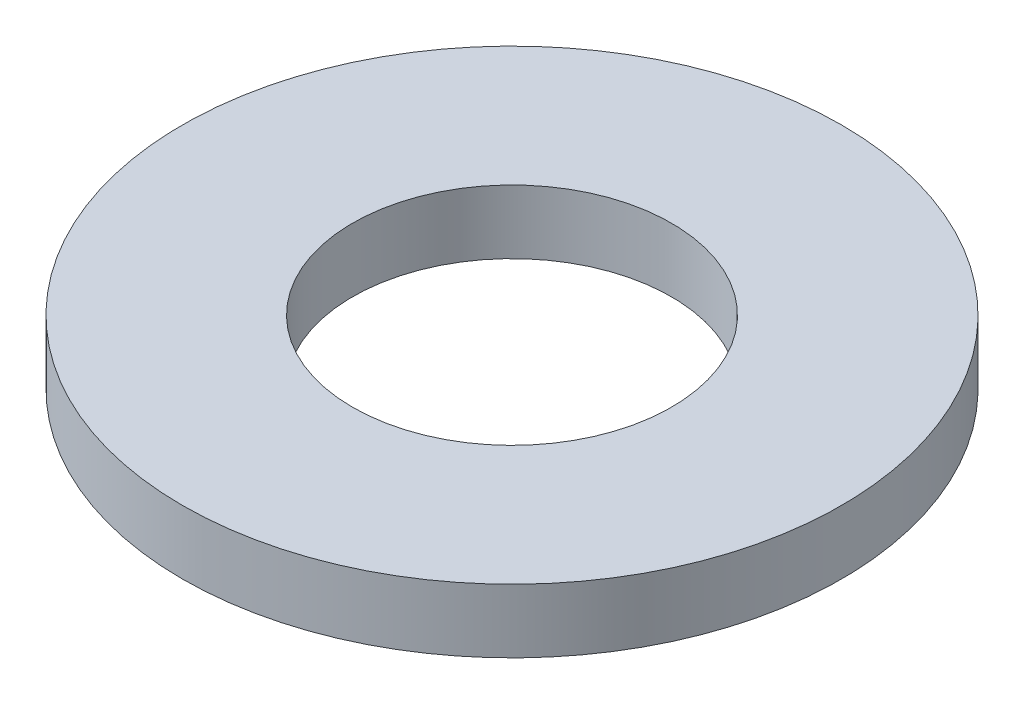
ISO-10303-21;
HEADER;
FILE_DESCRIPTION(('STEP AP214'),'2;1');
FILE_NAME('part.step','',(''),(''),'','','');
FILE_SCHEMA(('AUTOMOTIVE_DESIGN { 1 0 10303 214 1 1 1 1 }'));
ENDSEC;
DATA;
#1=APPLICATION_CONTEXT('core data for automotive mechanical design processes');
#2=APPLICATION_PROTOCOL_DEFINITION('international standard','automotive_design',2000,#1);
#3=PRODUCT_CONTEXT('',#1,'mechanical');
#4=PRODUCT('Part','Part','',(#3));
#5=PRODUCT_RELATED_PRODUCT_CATEGORY('part','',(#4));
#6=PRODUCT_DEFINITION_FORMATION('','',#4);
#7=PRODUCT_DEFINITION_CONTEXT('part definition',#1,'design');
#8=PRODUCT_DEFINITION('design','',#6,#7);
#9=PRODUCT_DEFINITION_SHAPE('','',#8);
#10=(LENGTH_UNIT() NAMED_UNIT(*) SI_UNIT(.MILLI.,.METRE.));
#11=(NAMED_UNIT(*) PLANE_ANGLE_UNIT() SI_UNIT($,.RADIAN.));
#12=(NAMED_UNIT(*) SI_UNIT($,.STERADIAN.) SOLID_ANGLE_UNIT());
#13=UNCERTAINTY_MEASURE_WITH_UNIT(LENGTH_MEASURE(1.E-05),#10,'distance_accuracy_value','');
#14=(GEOMETRIC_REPRESENTATION_CONTEXT(3) GLOBAL_UNCERTAINTY_ASSIGNED_CONTEXT((#13)) GLOBAL_UNIT_ASSIGNED_CONTEXT((#10,
#11,#12)) REPRESENTATION_CONTEXT('',''));
#15=CARTESIAN_POINT('',(0.,0.,0.));
#16=DIRECTION('',(0.,0.,1.));
#17=DIRECTION('',(1.,0.,0.));
#18=AXIS2_PLACEMENT_3D('',#15,#16,#17);
#19=CARTESIAN_POINT('',(0.,3.,0.));
#20=DIRECTION('',(0.,1.,0.));
#21=DIRECTION('',(0.,0.,1.));
#22=AXIS2_PLACEMENT_3D('',#19,#20,#21);
#23=PLANE('',#22);
#24=CARTESIAN_POINT('',(0.,3.,0.));
#25=DIRECTION('',(0.,1.,0.));
#26=DIRECTION('',(0.,0.,1.));
#27=AXIS2_PLACEMENT_3D('',#24,#25,#26);
#28=CIRCLE('',#27,31.);
#29=CARTESIAN_POINT('',(0.,3.,31.));
#30=VERTEX_POINT('',#29);
#31=EDGE_CURVE('E10',#30,#30,#28,.T.);
#32=ORIENTED_EDGE('',*,*,#31,.T.);
#33=EDGE_LOOP('',(#32));
#34=FACE_BOUND('',#33,.T.);
#35=CARTESIAN_POINT('',(0.,3.,0.));
#36=DIRECTION('',(0.,1.,0.));
#37=DIRECTION('',(0.,0.,1.));
#38=AXIS2_PLACEMENT_3D('',#35,#36,#37);
#39=CIRCLE('',#38,15.);
#40=CARTESIAN_POINT('',(0.,3.,15.));
#41=VERTEX_POINT('',#40);
#42=EDGE_CURVE('E56',#41,#41,#39,.T.);
#43=ORIENTED_EDGE('',*,*,#42,.F.);
#44=EDGE_LOOP('',(#43));
#45=FACE_BOUND('',#44,.T.);
#46=ADVANCED_FACE('F43',(#34,#45),#23,.T.);
#47=CARTESIAN_POINT('',(0.,-3.,0.));
#48=DIRECTION('',(0.,1.,0.));
#49=DIRECTION('',(0.,0.,1.));
#50=AXIS2_PLACEMENT_3D('',#47,#48,#49);
#51=PLANE('',#50);
#52=CARTESIAN_POINT('',(0.,-3.,0.));
#53=DIRECTION('',(0.,1.,0.));
#54=DIRECTION('',(0.,0.,1.));
#55=AXIS2_PLACEMENT_3D('',#52,#53,#54);
#56=CIRCLE('',#55,31.);
#57=CARTESIAN_POINT('',(0.,-3.,31.));
#58=VERTEX_POINT('',#57);
#59=EDGE_CURVE('E47',#58,#58,#56,.T.);
#60=ORIENTED_EDGE('',*,*,#59,.F.);
#61=EDGE_LOOP('',(#60));
#62=FACE_BOUND('',#61,.T.);
#63=CARTESIAN_POINT('',(0.,-3.,0.));
#64=DIRECTION('',(0.,1.,0.));
#65=DIRECTION('',(0.,0.,1.));
#66=AXIS2_PLACEMENT_3D('',#63,#64,#65);
#67=CIRCLE('',#66,15.);
#68=CARTESIAN_POINT('',(0.,-3.,15.));
#69=VERTEX_POINT('',#68);
#70=EDGE_CURVE('E58',#69,#69,#67,.T.);
#71=ORIENTED_EDGE('',*,*,#70,.T.);
#72=EDGE_LOOP('',(#71));
#73=FACE_BOUND('',#72,.T.);
#74=ADVANCED_FACE('F70',(#62,#73),#51,.F.);
#75=CARTESIAN_POINT('',(0.,3.,0.));
#76=DIRECTION('',(0.,-1.,0.));
#77=DIRECTION('',(0.,0.,-1.));
#78=AXIS2_PLACEMENT_3D('',#75,#76,#77);
#79=CYLINDRICAL_SURFACE('',#78,31.);
#80=ORIENTED_EDGE('',*,*,#31,.F.);
#81=EDGE_LOOP('',(#80));
#82=FACE_BOUND('',#81,.T.);
#83=ORIENTED_EDGE('',*,*,#59,.T.);
#84=EDGE_LOOP('',(#83));
#85=FACE_BOUND('',#84,.T.);
#86=ADVANCED_FACE('F45',(#82,#85),#79,.T.);
#87=CARTESIAN_POINT('',(0.,3.,0.));
#88=DIRECTION('',(0.,-1.,0.));
#89=DIRECTION('',(0.,0.,-1.));
#90=AXIS2_PLACEMENT_3D('',#87,#88,#89);
#91=CYLINDRICAL_SURFACE('',#90,15.);
#92=ORIENTED_EDGE('',*,*,#42,.T.);
#93=EDGE_LOOP('',(#92));
#94=FACE_BOUND('',#93,.T.);
#95=ORIENTED_EDGE('',*,*,#70,.F.);
#96=EDGE_LOOP('',(#95));
#97=FACE_BOUND('',#96,.T.);
#98=ADVANCED_FACE('F66',(#94,#97),#91,.F.);
#99=CLOSED_SHELL('',(#46,#74,#86,#98));
#100=MANIFOLD_SOLID_BREP('B2',#99);
#101=ADVANCED_BREP_SHAPE_REPRESENTATION('',(#18,#100),#14);
#102=SHAPE_DEFINITION_REPRESENTATION(#9,#101);
ENDSEC;
END-ISO-10303-21;
